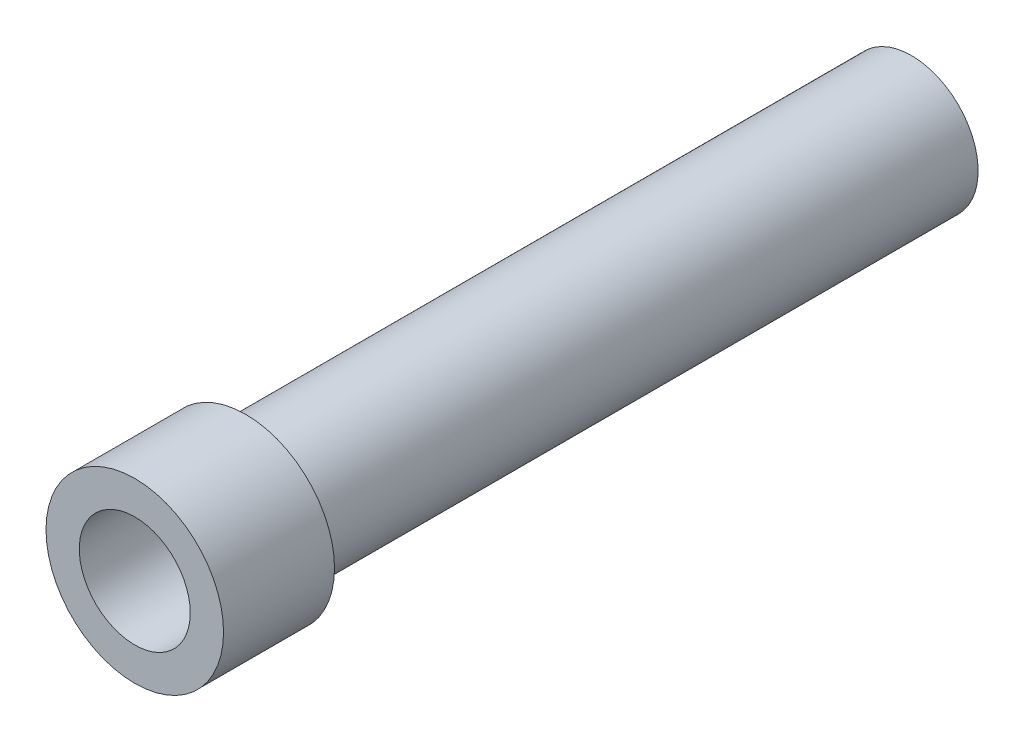
ISO-10303-21;
HEADER;
FILE_DESCRIPTION(('STEP AP214'),'2;1');
FILE_NAME('part.step','',(''),(''),'','','');
FILE_SCHEMA(('AUTOMOTIVE_DESIGN { 1 0 10303 214 1 1 1 1 }'));
ENDSEC;
DATA;
#1=APPLICATION_CONTEXT('core data for automotive mechanical design processes');
#2=APPLICATION_PROTOCOL_DEFINITION('international standard','automotive_design',2000,#1);
#3=PRODUCT_CONTEXT('',#1,'mechanical');
#4=PRODUCT('Part','Part','',(#3));
#5=PRODUCT_RELATED_PRODUCT_CATEGORY('part','',(#4));
#6=PRODUCT_DEFINITION_FORMATION('','',#4);
#7=PRODUCT_DEFINITION_CONTEXT('part definition',#1,'design');
#8=PRODUCT_DEFINITION('design','',#6,#7);
#9=PRODUCT_DEFINITION_SHAPE('','',#8);
#10=(LENGTH_UNIT() NAMED_UNIT(*) SI_UNIT(.MILLI.,.METRE.));
#11=(NAMED_UNIT(*) PLANE_ANGLE_UNIT() SI_UNIT($,.RADIAN.));
#12=(NAMED_UNIT(*) SI_UNIT($,.STERADIAN.) SOLID_ANGLE_UNIT());
#13=UNCERTAINTY_MEASURE_WITH_UNIT(LENGTH_MEASURE(1.E-05),#10,'distance_accuracy_value','');
#14=(GEOMETRIC_REPRESENTATION_CONTEXT(3) GLOBAL_UNCERTAINTY_ASSIGNED_CONTEXT((#13)) GLOBAL_UNIT_ASSIGNED_CONTEXT((#10,
#11,#12)) REPRESENTATION_CONTEXT('',''));
#15=CARTESIAN_POINT('',(0.,0.,0.));
#16=DIRECTION('',(0.,0.,1.));
#17=DIRECTION('',(1.,0.,0.));
#18=AXIS2_PLACEMENT_3D('',#15,#16,#17);
#19=CARTESIAN_POINT('',(-21.2024389130223,3.95852329038651,35.));
#20=DIRECTION('',(0.,0.,-1.));
#21=DIRECTION('',(-1.,0.,0.));
#22=AXIS2_PLACEMENT_3D('',#19,#20,#21);
#23=CYLINDRICAL_SURFACE('',#22,4.);
#24=CARTESIAN_POINT('',(-21.2024389130223,3.95852329038651,35.));
#25=DIRECTION('',(0.,0.,1.));
#26=DIRECTION('',(1.,0.,0.));
#27=AXIS2_PLACEMENT_3D('',#24,#25,#26);
#28=CIRCLE('',#27,4.);
#29=CARTESIAN_POINT('',(-17.2024389130223,3.95852329038651,35.));
#30=VERTEX_POINT('',#29);
#31=EDGE_CURVE('E10',#30,#30,#28,.T.);
#32=ORIENTED_EDGE('',*,*,#31,.F.);
#33=EDGE_LOOP('',(#32));
#34=FACE_BOUND('',#33,.T.);
#35=CARTESIAN_POINT('',(-21.2024389130223,3.95852329038651,30.));
#36=DIRECTION('',(0.,0.,-1.));
#37=DIRECTION('',(-1.,0.,0.));
#38=AXIS2_PLACEMENT_3D('',#35,#36,#37);
#39=CIRCLE('',#38,4.);
#40=CARTESIAN_POINT('',(-25.2024389130223,3.95852329038651,30.));
#41=VERTEX_POINT('',#40);
#42=EDGE_CURVE('E39',#41,#41,#39,.T.);
#43=ORIENTED_EDGE('',*,*,#42,.F.);
#44=EDGE_LOOP('',(#43));
#45=FACE_BOUND('',#44,.T.);
#46=ADVANCED_FACE('F36',(#34,#45),#23,.T.);
#47=CARTESIAN_POINT('',(-21.2024389130223,3.95852329038651,35.));
#48=DIRECTION('',(0.,0.,1.));
#49=DIRECTION('',(1.,0.,0.));
#50=AXIS2_PLACEMENT_3D('',#47,#48,#49);
#51=PLANE('',#50);
#52=CARTESIAN_POINT('',(-21.2024389130223,3.95852329038651,35.));
#53=DIRECTION('',(0.,0.,1.));
#54=DIRECTION('',(1.,0.,0.));
#55=AXIS2_PLACEMENT_3D('',#52,#53,#54);
#56=CIRCLE('',#55,2.5);
#57=CARTESIAN_POINT('',(-18.7024389130223,3.95852329038651,35.));
#58=VERTEX_POINT('',#57);
#59=EDGE_CURVE('E50',#58,#58,#56,.T.);
#60=ORIENTED_EDGE('',*,*,#59,.F.);
#61=EDGE_LOOP('',(#60));
#62=FACE_BOUND('',#61,.T.);
#63=ORIENTED_EDGE('',*,*,#31,.T.);
#64=EDGE_LOOP('',(#63));
#65=FACE_BOUND('',#64,.T.);
#66=ADVANCED_FACE('F71',(#62,#65),#51,.T.);
#67=CARTESIAN_POINT('',(-21.2024389130223,3.95852329038651,8.));
#68=DIRECTION('',(0.,0.,1.));
#69=DIRECTION('',(1.,0.,0.));
#70=AXIS2_PLACEMENT_3D('',#67,#68,#69);
#71=CYLINDRICAL_SURFACE('',#70,2.5);
#72=CARTESIAN_POINT('',(-21.2024389130223,3.95852329038651,8.));
#73=DIRECTION('',(0.,0.,1.));
#74=DIRECTION('',(1.,0.,0.));
#75=AXIS2_PLACEMENT_3D('',#72,#73,#74);
#76=CIRCLE('',#75,2.5);
#77=CARTESIAN_POINT('',(-18.7024389130223,3.95852329038651,8.));
#78=VERTEX_POINT('',#77);
#79=EDGE_CURVE('E44',#78,#78,#76,.T.);
#80=ORIENTED_EDGE('',*,*,#79,.F.);
#81=EDGE_LOOP('',(#80));
#82=FACE_BOUND('',#81,.T.);
#83=ORIENTED_EDGE('',*,*,#59,.T.);
#84=EDGE_LOOP('',(#83));
#85=FACE_BOUND('',#84,.T.);
#86=ADVANCED_FACE('F76',(#82,#85),#71,.F.);
#87=CARTESIAN_POINT('',(-21.2024389130223,3.95852329038651,8.));
#88=DIRECTION('',(0.,0.,1.));
#89=DIRECTION('',(1.,0.,0.));
#90=AXIS2_PLACEMENT_3D('',#87,#88,#89);
#91=PLANE('',#90);
#92=ORIENTED_EDGE('',*,*,#79,.T.);
#93=EDGE_LOOP('',(#92));
#94=FACE_BOUND('',#93,.T.);
#95=ADVANCED_FACE('F82',(#94),#91,.T.);
#96=CARTESIAN_POINT('',(-21.2024389130223,3.95852329038651,30.));
#97=DIRECTION('',(0.,0.,-1.));
#98=DIRECTION('',(-1.,0.,0.));
#99=AXIS2_PLACEMENT_3D('',#96,#97,#98);
#100=PLANE('',#99);
#101=CARTESIAN_POINT('',(-21.2024389130223,3.95852329038651,30.));
#102=DIRECTION('',(0.,0.,-1.));
#103=DIRECTION('',(-1.,0.,0.));
#104=AXIS2_PLACEMENT_3D('',#101,#102,#103);
#105=CIRCLE('',#104,3.);
#106=CARTESIAN_POINT('',(-24.2024389130223,3.95852329038651,30.));
#107=VERTEX_POINT('',#106);
#108=EDGE_CURVE('E60',#107,#107,#105,.T.);
#109=ORIENTED_EDGE('',*,*,#108,.F.);
#110=EDGE_LOOP('',(#109));
#111=FACE_BOUND('',#110,.T.);
#112=ORIENTED_EDGE('',*,*,#42,.T.);
#113=EDGE_LOOP('',(#112));
#114=FACE_BOUND('',#113,.T.);
#115=ADVANCED_FACE('F68',(#111,#114),#100,.T.);
#116=CARTESIAN_POINT('',(-21.2024389130223,3.95852329038651,30.));
#117=DIRECTION('',(0.,0.,-1.));
#118=DIRECTION('',(-1.,0.,0.));
#119=AXIS2_PLACEMENT_3D('',#116,#117,#118);
#120=CYLINDRICAL_SURFACE('',#119,3.);
#121=ORIENTED_EDGE('',*,*,#108,.T.);
#122=EDGE_LOOP('',(#121));
#123=FACE_BOUND('',#122,.T.);
#124=CARTESIAN_POINT('',(-21.2024389130223,3.95852329038651,0.));
#125=DIRECTION('',(0.,0.,-1.));
#126=DIRECTION('',(-1.,0.,0.));
#127=AXIS2_PLACEMENT_3D('',#124,#125,#126);
#128=CIRCLE('',#127,3.);
#129=CARTESIAN_POINT('',(-24.2024389130223,3.95852329038651,0.));
#130=VERTEX_POINT('',#129);
#131=EDGE_CURVE('E56',#130,#130,#128,.T.);
#132=ORIENTED_EDGE('',*,*,#131,.F.);
#133=EDGE_LOOP('',(#132));
#134=FACE_BOUND('',#133,.T.);
#135=ADVANCED_FACE('F89',(#123,#134),#120,.T.);
#136=CARTESIAN_POINT('',(-21.2024389130223,3.95852329038651,0.));
#137=DIRECTION('',(0.,0.,1.));
#138=DIRECTION('',(1.,0.,0.));
#139=AXIS2_PLACEMENT_3D('',#136,#137,#138);
#140=PLANE('',#139);
#141=ORIENTED_EDGE('',*,*,#131,.T.);
#142=EDGE_LOOP('',(#141));
#143=FACE_BOUND('',#142,.T.);
#144=ADVANCED_FACE('F87',(#143),#140,.F.);
#145=CLOSED_SHELL('',(#46,#66,#86,#95,#115,#135,#144));
#146=MANIFOLD_SOLID_BREP('B2',#145);
#147=ADVANCED_BREP_SHAPE_REPRESENTATION('',(#18,#146),#14);
#148=SHAPE_DEFINITION_REPRESENTATION(#9,#147);
ENDSEC;
END-ISO-10303-21;
